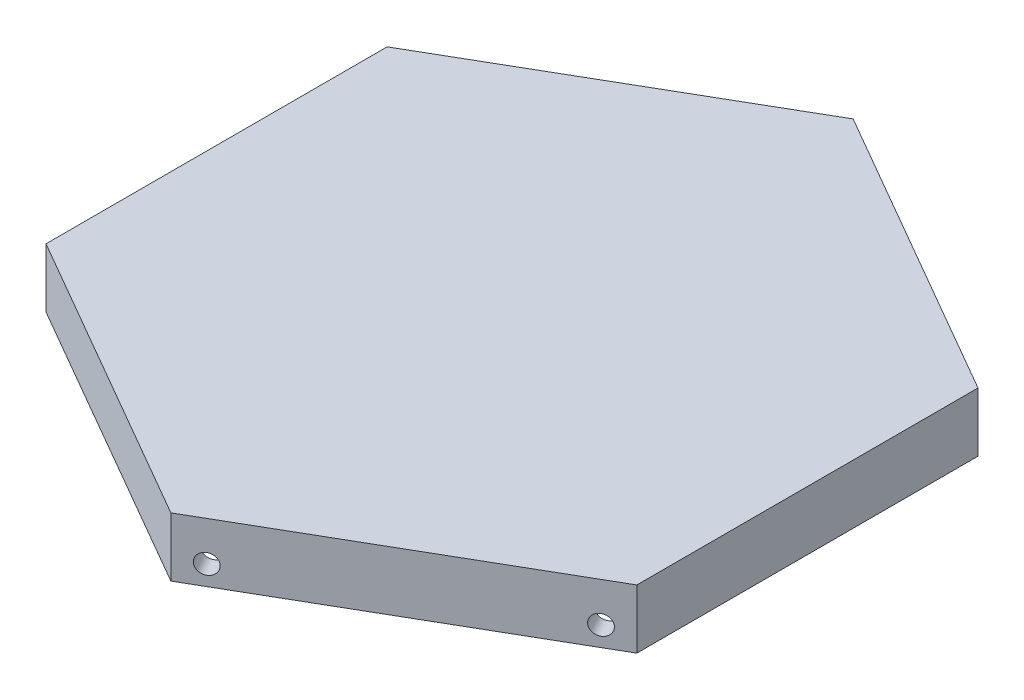
ISO-10303-21;
HEADER;
FILE_DESCRIPTION(('STEP AP214'),'2;1');
FILE_NAME('part.step','',(''),(''),'','','');
FILE_SCHEMA(('AUTOMOTIVE_DESIGN { 1 0 10303 214 1 1 1 1 }'));
ENDSEC;
DATA;
#1=APPLICATION_CONTEXT('core data for automotive mechanical design processes');
#2=APPLICATION_PROTOCOL_DEFINITION('international standard','automotive_design',2000,#1);
#3=PRODUCT_CONTEXT('',#1,'mechanical');
#4=PRODUCT('Part','Part','',(#3));
#5=PRODUCT_RELATED_PRODUCT_CATEGORY('part','',(#4));
#6=PRODUCT_DEFINITION_FORMATION('','',#4);
#7=PRODUCT_DEFINITION_CONTEXT('part definition',#1,'design');
#8=PRODUCT_DEFINITION('design','',#6,#7);
#9=PRODUCT_DEFINITION_SHAPE('','',#8);
#10=(LENGTH_UNIT() NAMED_UNIT(*) SI_UNIT(.MILLI.,.METRE.));
#11=(NAMED_UNIT(*) PLANE_ANGLE_UNIT() SI_UNIT($,.RADIAN.));
#12=(NAMED_UNIT(*) SI_UNIT($,.STERADIAN.) SOLID_ANGLE_UNIT());
#13=UNCERTAINTY_MEASURE_WITH_UNIT(LENGTH_MEASURE(1.E-05),#10,'distance_accuracy_value','');
#14=(GEOMETRIC_REPRESENTATION_CONTEXT(3) GLOBAL_UNCERTAINTY_ASSIGNED_CONTEXT((#13)) GLOBAL_UNIT_ASSIGNED_CONTEXT((#10,
#11,#12)) REPRESENTATION_CONTEXT('',''));
#15=CARTESIAN_POINT('',(0.,0.,0.));
#16=DIRECTION('',(0.,0.,1.));
#17=DIRECTION('',(1.,0.,0.));
#18=AXIS2_PLACEMENT_3D('',#15,#16,#17);
#19=CARTESIAN_POINT('',(44.9999999999996,9.,-25.9807621135336));
#20=DIRECTION('',(-0.499999999999995,0.,0.866025403784441));
#21=DIRECTION('',(0.866025403784441,0.,0.499999999999995));
#22=AXIS2_PLACEMENT_3D('',#19,#20,#21);
#23=PLANE('',#22);
#24=CARTESIAN_POINT('',(41.5358983848618,3.,-27.9807621135336));
#25=DIRECTION('',(0.499999999999995,0.,-0.866025403784441));
#26=DIRECTION('',(-0.866025403784441,0.,-0.499999999999995));
#27=AXIS2_PLACEMENT_3D('',#24,#25,#26);
#28=CIRCLE('',#27,1.5);
#29=CARTESIAN_POINT('',(40.2368602791852,3.,-28.7307621135336));
#30=VERTEX_POINT('',#29);
#31=EDGE_CURVE('E191',#30,#30,#28,.T.);
#32=ORIENTED_EDGE('',*,*,#31,.F.);
#33=EDGE_LOOP('',(#32));
#34=FACE_BOUND('',#33,.T.);
#35=CARTESIAN_POINT('',(3.46410161513776,3.,-49.9615242270662));
#36=DIRECTION('',(0.499999999999995,0.,-0.866025403784441));
#37=DIRECTION('',(0.866025403784441,0.,0.499999999999995));
#38=AXIS2_PLACEMENT_3D('',#35,#36,#37);
#39=CIRCLE('',#38,1.5);
#40=CARTESIAN_POINT('',(4.76313972081443,3.,-49.2115242270663));
#41=VERTEX_POINT('',#40);
#42=EDGE_CURVE('E199',#41,#41,#39,.T.);
#43=ORIENTED_EDGE('',*,*,#42,.F.);
#44=EDGE_LOOP('',(#43));
#45=FACE_BOUND('',#44,.T.);
#46=DIRECTION('',(-0.866025403784441,0.,-0.499999999999995));
#47=VECTOR('',#46,1.);
#48=CARTESIAN_POINT('',(44.9999999999996,0.,-25.9807621135336));
#49=LINE('',#48,#47);
#50=CARTESIAN_POINT('',(44.9999999999996,0.,-25.9807621135336));
#51=VERTEX_POINT('',#50);
#52=CARTESIAN_POINT('',(0.,0.,-51.9615242270662));
#53=VERTEX_POINT('',#52);
#54=EDGE_CURVE('E142',#51,#53,#49,.T.);
#55=ORIENTED_EDGE('',*,*,#54,.T.);
#56=DIRECTION('',(0.,-1.,0.));
#57=VECTOR('',#56,1.);
#58=CARTESIAN_POINT('',(0.,9.,-51.9615242270662));
#59=LINE('',#58,#57);
#60=CARTESIAN_POINT('',(0.,9.,-51.9615242270662));
#61=VERTEX_POINT('',#60);
#62=EDGE_CURVE('E11',#61,#53,#59,.T.);
#63=ORIENTED_EDGE('',*,*,#62,.F.);
#64=DIRECTION('',(-0.866025403784441,0.,-0.499999999999995));
#65=VECTOR('',#64,1.);
#66=CARTESIAN_POINT('',(44.9999999999996,9.,-25.9807621135336));
#67=LINE('',#66,#65);
#68=CARTESIAN_POINT('',(44.9999999999996,9.,-25.9807621135336));
#69=VERTEX_POINT('',#68);
#70=EDGE_CURVE('E160',#69,#61,#67,.T.);
#71=ORIENTED_EDGE('',*,*,#70,.F.);
#72=DIRECTION('',(0.,-1.,0.));
#73=VECTOR('',#72,1.);
#74=CARTESIAN_POINT('',(44.9999999999996,9.,-25.9807621135336));
#75=LINE('',#74,#73);
#76=EDGE_CURVE('E138',#69,#51,#75,.T.);
#77=ORIENTED_EDGE('',*,*,#76,.T.);
#78=EDGE_LOOP('',(#55,#63,#71,#77));
#79=FACE_BOUND('',#78,.T.);
#80=ADVANCED_FACE('F39',(#34,#45,#79),#23,.F.);
#81=CARTESIAN_POINT('',(0.,9.,-51.9615242270662));
#82=DIRECTION('',(0.500000000000001,0.,0.866025403784438));
#83=DIRECTION('',(0.866025403784438,0.,-0.500000000000001));
#84=AXIS2_PLACEMENT_3D('',#81,#82,#83);
#85=PLANE('',#84);
#86=DIRECTION('',(-0.866025403784438,0.,0.500000000000001));
#87=VECTOR('',#86,1.);
#88=CARTESIAN_POINT('',(0.,0.,-51.9615242270662));
#89=LINE('',#88,#87);
#90=CARTESIAN_POINT('',(-45.,0.,-25.980762113533));
#91=VERTEX_POINT('',#90);
#92=EDGE_CURVE('E146',#53,#91,#89,.T.);
#93=ORIENTED_EDGE('',*,*,#92,.T.);
#94=DIRECTION('',(0.,-1.,0.));
#95=VECTOR('',#94,1.);
#96=CARTESIAN_POINT('',(-45.,9.,-25.980762113533));
#97=LINE('',#96,#95);
#98=CARTESIAN_POINT('',(-45.,9.,-25.980762113533));
#99=VERTEX_POINT('',#98);
#100=EDGE_CURVE('E48',#99,#91,#97,.T.);
#101=ORIENTED_EDGE('',*,*,#100,.F.);
#102=DIRECTION('',(-0.866025403784438,0.,0.500000000000001));
#103=VECTOR('',#102,1.);
#104=CARTESIAN_POINT('',(0.,9.,-51.9615242270662));
#105=LINE('',#104,#103);
#106=EDGE_CURVE('E100',#61,#99,#105,.T.);
#107=ORIENTED_EDGE('',*,*,#106,.F.);
#108=ORIENTED_EDGE('',*,*,#62,.T.);
#109=EDGE_LOOP('',(#93,#101,#107,#108));
#110=FACE_BOUND('',#109,.T.);
#111=ADVANCED_FACE('F292',(#110),#85,.F.);
#112=CARTESIAN_POINT('',(-45.,9.,-25.980762113533));
#113=DIRECTION('',(1.,0.,0.));
#114=DIRECTION('',(0.,0.,-1.));
#115=AXIS2_PLACEMENT_3D('',#112,#113,#114);
#116=PLANE('',#115);
#117=CARTESIAN_POINT('',(-45.,3.,-21.980762113533));
#118=DIRECTION('',(-1.,0.,0.));
#119=DIRECTION('',(0.,0.,1.));
#120=AXIS2_PLACEMENT_3D('',#117,#118,#119);
#121=CIRCLE('',#120,1.5);
#122=CARTESIAN_POINT('',(-45.,3.,-20.480762113533));
#123=VERTEX_POINT('',#122);
#124=EDGE_CURVE('E175',#123,#123,#121,.T.);
#125=ORIENTED_EDGE('',*,*,#124,.F.);
#126=EDGE_LOOP('',(#125));
#127=FACE_BOUND('',#126,.T.);
#128=CARTESIAN_POINT('',(-44.9999999999998,3.,21.9807621135333));
#129=DIRECTION('',(-1.,0.,0.));
#130=DIRECTION('',(0.,0.,-1.));
#131=AXIS2_PLACEMENT_3D('',#128,#129,#130);
#132=CIRCLE('',#131,1.5);
#133=CARTESIAN_POINT('',(-44.9999999999998,3.,20.4807621135333));
#134=VERTEX_POINT('',#133);
#135=EDGE_CURVE('E187',#134,#134,#132,.T.);
#136=ORIENTED_EDGE('',*,*,#135,.F.);
#137=EDGE_LOOP('',(#136));
#138=FACE_BOUND('',#137,.T.);
#139=DIRECTION('',(0.,0.,1.));
#140=VECTOR('',#139,1.);
#141=CARTESIAN_POINT('',(-45.,0.,-25.980762113533));
#142=LINE('',#141,#140);
#143=CARTESIAN_POINT('',(-44.9999999999998,0.,25.9807621135333));
#144=VERTEX_POINT('',#143);
#145=EDGE_CURVE('E150',#91,#144,#142,.T.);
#146=ORIENTED_EDGE('',*,*,#145,.T.);
#147=DIRECTION('',(0.,-1.,0.));
#148=VECTOR('',#147,1.);
#149=CARTESIAN_POINT('',(-44.9999999999998,9.,25.9807621135333));
#150=LINE('',#149,#148);
#151=CARTESIAN_POINT('',(-44.9999999999998,9.,25.9807621135333));
#152=VERTEX_POINT('',#151);
#153=EDGE_CURVE('E131',#152,#144,#150,.T.);
#154=ORIENTED_EDGE('',*,*,#153,.F.);
#155=DIRECTION('',(0.,0.,1.));
#156=VECTOR('',#155,1.);
#157=CARTESIAN_POINT('',(-45.,9.,-25.980762113533));
#158=LINE('',#157,#156);
#159=EDGE_CURVE('E117',#99,#152,#158,.T.);
#160=ORIENTED_EDGE('',*,*,#159,.F.);
#161=ORIENTED_EDGE('',*,*,#100,.T.);
#162=EDGE_LOOP('',(#146,#154,#160,#161));
#163=FACE_BOUND('',#162,.T.);
#164=ADVANCED_FACE('F295',(#127,#138,#163),#116,.F.);
#165=CARTESIAN_POINT('',(-44.9999999999998,9.,25.9807621135333));
#166=DIRECTION('',(0.499999999999995,0.,-0.866025403784442));
#167=DIRECTION('',(-0.866025403784442,0.,-0.499999999999995));
#168=AXIS2_PLACEMENT_3D('',#165,#166,#167);
#169=PLANE('',#168);
#170=DIRECTION('',(0.866025403784442,0.,0.499999999999995));
#171=VECTOR('',#170,1.);
#172=CARTESIAN_POINT('',(-44.9999999999998,0.,25.9807621135333));
#173=LINE('',#172,#171);
#174=CARTESIAN_POINT('',(3.62845384353294E-13,0.,51.9615242270662));
#175=VERTEX_POINT('',#174);
#176=EDGE_CURVE('E127',#144,#175,#173,.T.);
#177=ORIENTED_EDGE('',*,*,#176,.T.);
#178=DIRECTION('',(0.,-1.,0.));
#179=VECTOR('',#178,1.);
#180=CARTESIAN_POINT('',(3.62845384353294E-13,9.,51.9615242270662));
#181=LINE('',#180,#179);
#182=CARTESIAN_POINT('',(3.62845384353294E-13,9.,51.9615242270662));
#183=VERTEX_POINT('',#182);
#184=EDGE_CURVE('E124',#183,#175,#181,.T.);
#185=ORIENTED_EDGE('',*,*,#184,.F.);
#186=DIRECTION('',(0.866025403784442,0.,0.499999999999995));
#187=VECTOR('',#186,1.);
#188=CARTESIAN_POINT('',(-44.9999999999998,9.,25.9807621135333));
#189=LINE('',#188,#187);
#190=EDGE_CURVE('E110',#152,#183,#189,.T.);
#191=ORIENTED_EDGE('',*,*,#190,.F.);
#192=ORIENTED_EDGE('',*,*,#153,.T.);
#193=EDGE_LOOP('',(#177,#185,#191,#192));
#194=FACE_BOUND('',#193,.T.);
#195=ADVANCED_FACE('F125',(#194),#169,.F.);
#196=CARTESIAN_POINT('',(3.62845384353294E-13,9.,51.9615242270662));
#197=DIRECTION('',(-0.500000000000007,0.,-0.866025403784434));
#198=DIRECTION('',(-0.866025403784435,0.,0.500000000000007));
#199=AXIS2_PLACEMENT_3D('',#196,#197,#198);
#200=PLANE('',#199);
#201=CARTESIAN_POINT('',(3.46410161513811,3.,49.9615242270662));
#202=DIRECTION('',(0.500000000000007,0.,0.866025403784435));
#203=DIRECTION('',(0.866025403784435,0.,-0.500000000000007));
#204=AXIS2_PLACEMENT_3D('',#201,#202,#203);
#205=CIRCLE('',#204,1.5);
#206=CARTESIAN_POINT('',(4.76313972081476,3.,49.2115242270662));
#207=VERTEX_POINT('',#206);
#208=EDGE_CURVE('E184',#207,#207,#205,.T.);
#209=ORIENTED_EDGE('',*,*,#208,.F.);
#210=EDGE_LOOP('',(#209));
#211=FACE_BOUND('',#210,.T.);
#212=CARTESIAN_POINT('',(41.5358983848624,3.,27.9807621135327));
#213=DIRECTION('',(0.500000000000007,0.,0.866025403784435));
#214=DIRECTION('',(-0.866025403784435,0.,0.500000000000007));
#215=AXIS2_PLACEMENT_3D('',#212,#213,#214);
#216=CIRCLE('',#215,1.5);
#217=CARTESIAN_POINT('',(40.2368602791858,3.,28.7307621135327));
#218=VERTEX_POINT('',#217);
#219=EDGE_CURVE('E197',#218,#218,#216,.T.);
#220=ORIENTED_EDGE('',*,*,#219,.F.);
#221=EDGE_LOOP('',(#220));
#222=FACE_BOUND('',#221,.T.);
#223=DIRECTION('',(0.866025403784435,0.,-0.500000000000007));
#224=VECTOR('',#223,1.);
#225=CARTESIAN_POINT('',(3.62845384353294E-13,0.,51.9615242270662));
#226=LINE('',#225,#224);
#227=CARTESIAN_POINT('',(45.0000000000002,0.,25.9807621135327));
#228=VERTEX_POINT('',#227);
#229=EDGE_CURVE('E155',#175,#228,#226,.T.);
#230=ORIENTED_EDGE('',*,*,#229,.T.);
#231=DIRECTION('',(0.,-1.,0.));
#232=VECTOR('',#231,1.);
#233=CARTESIAN_POINT('',(45.0000000000002,9.,25.9807621135327));
#234=LINE('',#233,#232);
#235=CARTESIAN_POINT('',(45.0000000000002,9.,25.9807621135327));
#236=VERTEX_POINT('',#235);
#237=EDGE_CURVE('E132',#236,#228,#234,.T.);
#238=ORIENTED_EDGE('',*,*,#237,.F.);
#239=DIRECTION('',(0.866025403784435,0.,-0.500000000000007));
#240=VECTOR('',#239,1.);
#241=CARTESIAN_POINT('',(3.62845384353294E-13,9.,51.9615242270662));
#242=LINE('',#241,#240);
#243=EDGE_CURVE('E114',#183,#236,#242,.T.);
#244=ORIENTED_EDGE('',*,*,#243,.F.);
#245=ORIENTED_EDGE('',*,*,#184,.T.);
#246=EDGE_LOOP('',(#230,#238,#244,#245));
#247=FACE_BOUND('',#246,.T.);
#248=ADVANCED_FACE('F134',(#211,#222,#247),#200,.F.);
#249=CARTESIAN_POINT('',(45.0000000000002,9.,25.9807621135327));
#250=DIRECTION('',(-1.,0.,0.));
#251=DIRECTION('',(0.,0.,1.));
#252=AXIS2_PLACEMENT_3D('',#249,#250,#251);
#253=PLANE('',#252);
#254=DIRECTION('',(0.,0.,-1.));
#255=VECTOR('',#254,1.);
#256=CARTESIAN_POINT('',(45.0000000000002,0.,25.9807621135327));
#257=LINE('',#256,#255);
#258=EDGE_CURVE('E92',#228,#51,#257,.T.);
#259=ORIENTED_EDGE('',*,*,#258,.T.);
#260=ORIENTED_EDGE('',*,*,#76,.F.);
#261=DIRECTION('',(0.,0.,-1.));
#262=VECTOR('',#261,1.);
#263=CARTESIAN_POINT('',(45.0000000000002,9.,25.9807621135327));
#264=LINE('',#263,#262);
#265=EDGE_CURVE('E65',#236,#69,#264,.T.);
#266=ORIENTED_EDGE('',*,*,#265,.F.);
#267=ORIENTED_EDGE('',*,*,#237,.T.);
#268=EDGE_LOOP('',(#259,#260,#266,#267));
#269=FACE_BOUND('',#268,.T.);
#270=ADVANCED_FACE('F299',(#269),#253,.F.);
#271=CARTESIAN_POINT('',(0.,9.,0.));
#272=DIRECTION('',(0.,1.,0.));
#273=DIRECTION('',(0.,0.,1.));
#274=AXIS2_PLACEMENT_3D('',#271,#272,#273);
#275=PLANE('',#274);
#276=ORIENTED_EDGE('',*,*,#70,.T.);
#277=ORIENTED_EDGE('',*,*,#106,.T.);
#278=ORIENTED_EDGE('',*,*,#159,.T.);
#279=ORIENTED_EDGE('',*,*,#190,.T.);
#280=ORIENTED_EDGE('',*,*,#243,.T.);
#281=ORIENTED_EDGE('',*,*,#265,.T.);
#282=EDGE_LOOP('',(#276,#277,#278,#279,#280,#281));
#283=FACE_BOUND('',#282,.T.);
#284=ADVANCED_FACE('F112',(#283),#275,.T.);
#285=CARTESIAN_POINT('',(0.,0.,0.));
#286=DIRECTION('',(0.,1.,0.));
#287=DIRECTION('',(0.,0.,1.));
#288=AXIS2_PLACEMENT_3D('',#285,#286,#287);
#289=PLANE('',#288);
#290=DIRECTION('',(-0.866025403784439,0.,-0.5));
#291=VECTOR('',#290,1.);
#292=CARTESIAN_POINT('',(0.,0.,48.4974226119285));
#293=LINE('',#292,#291);
#294=CARTESIAN_POINT('',(0.,0.,48.4974226119285));
#295=VERTEX_POINT('',#294);
#296=CARTESIAN_POINT('',(-42.,0.,24.2487113059643));
#297=VERTEX_POINT('',#296);
#298=EDGE_CURVE('E247',#295,#297,#293,.T.);
#299=ORIENTED_EDGE('',*,*,#298,.F.);
#300=DIRECTION('',(-0.866025403784439,0.,0.5));
#301=VECTOR('',#300,1.);
#302=CARTESIAN_POINT('',(42.,0.,24.2487113059643));
#303=LINE('',#302,#301);
#304=CARTESIAN_POINT('',(42.,0.,24.2487113059643));
#305=VERTEX_POINT('',#304);
#306=EDGE_CURVE('E56',#305,#295,#303,.T.);
#307=ORIENTED_EDGE('',*,*,#306,.F.);
#308=DIRECTION('',(0.,0.,1.));
#309=VECTOR('',#308,1.);
#310=CARTESIAN_POINT('',(42.,0.,-24.2487113059643));
#311=LINE('',#310,#309);
#312=CARTESIAN_POINT('',(42.,0.,-24.2487113059643));
#313=VERTEX_POINT('',#312);
#314=EDGE_CURVE('E224',#313,#305,#311,.T.);
#315=ORIENTED_EDGE('',*,*,#314,.F.);
#316=DIRECTION('',(0.866025403784439,0.,0.5));
#317=VECTOR('',#316,1.);
#318=CARTESIAN_POINT('',(0.,0.,-48.4974226119285));
#319=LINE('',#318,#317);
#320=CARTESIAN_POINT('',(0.,0.,-48.4974226119285));
#321=VERTEX_POINT('',#320);
#322=EDGE_CURVE('E259',#321,#313,#319,.T.);
#323=ORIENTED_EDGE('',*,*,#322,.F.);
#324=DIRECTION('',(0.866025403784439,0.,-0.5));
#325=VECTOR('',#324,1.);
#326=CARTESIAN_POINT('',(-42.,0.,-24.2487113059643));
#327=LINE('',#326,#325);
#328=CARTESIAN_POINT('',(-42.,0.,-24.2487113059643));
#329=VERTEX_POINT('',#328);
#330=EDGE_CURVE('E255',#329,#321,#327,.T.);
#331=ORIENTED_EDGE('',*,*,#330,.F.);
#332=DIRECTION('',(0.,0.,-1.));
#333=VECTOR('',#332,1.);
#334=CARTESIAN_POINT('',(-42.,0.,24.2487113059643));
#335=LINE('',#334,#333);
#336=EDGE_CURVE('E251',#297,#329,#335,.T.);
#337=ORIENTED_EDGE('',*,*,#336,.F.);
#338=EDGE_LOOP('',(#299,#307,#315,#323,#331,#337));
#339=FACE_BOUND('',#338,.T.);
#340=ORIENTED_EDGE('',*,*,#54,.F.);
#341=ORIENTED_EDGE('',*,*,#258,.F.);
#342=ORIENTED_EDGE('',*,*,#229,.F.);
#343=ORIENTED_EDGE('',*,*,#176,.F.);
#344=ORIENTED_EDGE('',*,*,#145,.F.);
#345=ORIENTED_EDGE('',*,*,#92,.F.);
#346=EDGE_LOOP('',(#340,#341,#342,#343,#344,#345));
#347=FACE_BOUND('',#346,.T.);
#348=ADVANCED_FACE('F298',(#339,#347),#289,.F.);
#349=CARTESIAN_POINT('',(42.,6.,24.2487113059643));
#350=DIRECTION('',(0.5,0.,0.866025403784439));
#351=DIRECTION('',(0.866025403784439,0.,-0.5));
#352=AXIS2_PLACEMENT_3D('',#349,#350,#351);
#353=PLANE('',#352);
#354=CARTESIAN_POINT('',(1.96410161513804,3.,47.3634480157128));
#355=DIRECTION('',(0.5,0.,0.866025403784439));
#356=DIRECTION('',(0.866025403784439,0.,-0.5));
#357=AXIS2_PLACEMENT_3D('',#354,#355,#356);
#358=CIRCLE('',#357,1.5);
#359=CARTESIAN_POINT('',(3.2631397208147,3.,46.6134480157128));
#360=VERTEX_POINT('',#359);
#361=EDGE_CURVE('E183',#360,#360,#358,.T.);
#362=ORIENTED_EDGE('',*,*,#361,.T.);
#363=EDGE_LOOP('',(#362));
#364=FACE_BOUND('',#363,.T.);
#365=CARTESIAN_POINT('',(40.0358983848625,3.,25.3826859021797));
#366=DIRECTION('',(0.5,0.,0.866025403784439));
#367=DIRECTION('',(0.866025403784439,0.,-0.5));
#368=AXIS2_PLACEMENT_3D('',#365,#366,#367);
#369=CIRCLE('',#368,1.5);
#370=CARTESIAN_POINT('',(41.3349364905392,3.,24.6326859021797));
#371=VERTEX_POINT('',#370);
#372=EDGE_CURVE('E179',#371,#371,#369,.T.);
#373=ORIENTED_EDGE('',*,*,#372,.T.);
#374=EDGE_LOOP('',(#373));
#375=FACE_BOUND('',#374,.T.);
#376=ORIENTED_EDGE('',*,*,#306,.T.);
#377=DIRECTION('',(0.,-1.,0.));
#378=VECTOR('',#377,1.);
#379=CARTESIAN_POINT('',(0.,6.,48.4974226119285));
#380=LINE('',#379,#378);
#381=CARTESIAN_POINT('',(0.,6.,48.4974226119285));
#382=VERTEX_POINT('',#381);
#383=EDGE_CURVE('E244',#382,#295,#380,.T.);
#384=ORIENTED_EDGE('',*,*,#383,.F.);
#385=DIRECTION('',(-0.866025403784439,0.,0.5));
#386=VECTOR('',#385,1.);
#387=CARTESIAN_POINT('',(42.,6.,24.2487113059643));
#388=LINE('',#387,#386);
#389=CARTESIAN_POINT('',(42.,6.,24.2487113059643));
#390=VERTEX_POINT('',#389);
#391=EDGE_CURVE('E219',#390,#382,#388,.T.);
#392=ORIENTED_EDGE('',*,*,#391,.F.);
#393=DIRECTION('',(0.,-1.,0.));
#394=VECTOR('',#393,1.);
#395=CARTESIAN_POINT('',(42.,6.,24.2487113059643));
#396=LINE('',#395,#394);
#397=EDGE_CURVE('E147',#390,#305,#396,.T.);
#398=ORIENTED_EDGE('',*,*,#397,.T.);
#399=EDGE_LOOP('',(#376,#384,#392,#398));
#400=FACE_BOUND('',#399,.T.);
#401=ADVANCED_FACE('F344',(#364,#375,#400),#353,.F.);
#402=CARTESIAN_POINT('',(42.,6.,-24.2487113059643));
#403=DIRECTION('',(1.,0.,0.));
#404=DIRECTION('',(0.,0.,-1.));
#405=AXIS2_PLACEMENT_3D('',#402,#403,#404);
#406=PLANE('',#405);
#407=ORIENTED_EDGE('',*,*,#314,.T.);
#408=ORIENTED_EDGE('',*,*,#397,.F.);
#409=DIRECTION('',(0.,0.,1.));
#410=VECTOR('',#409,1.);
#411=CARTESIAN_POINT('',(42.,6.,-24.2487113059643));
#412=LINE('',#411,#410);
#413=CARTESIAN_POINT('',(42.,6.,-24.2487113059643));
#414=VERTEX_POINT('',#413);
#415=EDGE_CURVE('E240',#414,#390,#412,.T.);
#416=ORIENTED_EDGE('',*,*,#415,.F.);
#417=DIRECTION('',(0.,-1.,0.));
#418=VECTOR('',#417,1.);
#419=CARTESIAN_POINT('',(42.,6.,-24.2487113059643));
#420=LINE('',#419,#418);
#421=EDGE_CURVE('E268',#414,#313,#420,.T.);
#422=ORIENTED_EDGE('',*,*,#421,.T.);
#423=EDGE_LOOP('',(#407,#408,#416,#422));
#424=FACE_BOUND('',#423,.T.);
#425=ADVANCED_FACE('F340',(#424),#406,.F.);
#426=CARTESIAN_POINT('',(0.,6.,-48.4974226119285));
#427=DIRECTION('',(0.5,0.,-0.866025403784439));
#428=DIRECTION('',(-0.866025403784439,0.,-0.5));
#429=AXIS2_PLACEMENT_3D('',#426,#427,#428);
#430=PLANE('',#429);
#431=CARTESIAN_POINT('',(40.0358983848618,3.,-25.3826859021801));
#432=DIRECTION('',(0.5,0.,-0.866025403784439));
#433=DIRECTION('',(-0.866025403784439,0.,-0.5));
#434=AXIS2_PLACEMENT_3D('',#431,#432,#433);
#435=CIRCLE('',#434,1.5);
#436=CARTESIAN_POINT('',(38.7368602791851,3.,-26.1326859021801));
#437=VERTEX_POINT('',#436);
#438=EDGE_CURVE('E42',#437,#437,#435,.T.);
#439=ORIENTED_EDGE('',*,*,#438,.T.);
#440=EDGE_LOOP('',(#439));
#441=FACE_BOUND('',#440,.T.);
#442=CARTESIAN_POINT('',(1.9641016151378,3.,-47.363448015713));
#443=DIRECTION('',(0.5,0.,-0.866025403784439));
#444=DIRECTION('',(-0.866025403784439,0.,-0.5));
#445=AXIS2_PLACEMENT_3D('',#442,#443,#444);
#446=CIRCLE('',#445,1.5);
#447=CARTESIAN_POINT('',(0.665063509461138,3.,-48.113448015713));
#448=VERTEX_POINT('',#447);
#449=EDGE_CURVE('E188',#448,#448,#446,.T.);
#450=ORIENTED_EDGE('',*,*,#449,.T.);
#451=EDGE_LOOP('',(#450));
#452=FACE_BOUND('',#451,.T.);
#453=ORIENTED_EDGE('',*,*,#322,.T.);
#454=ORIENTED_EDGE('',*,*,#421,.F.);
#455=DIRECTION('',(0.866025403784439,0.,0.5));
#456=VECTOR('',#455,1.);
#457=CARTESIAN_POINT('',(0.,6.,-48.4974226119285));
#458=LINE('',#457,#456);
#459=CARTESIAN_POINT('',(0.,6.,-48.4974226119285));
#460=VERTEX_POINT('',#459);
#461=EDGE_CURVE('E236',#460,#414,#458,.T.);
#462=ORIENTED_EDGE('',*,*,#461,.F.);
#463=DIRECTION('',(0.,-1.,0.));
#464=VECTOR('',#463,1.);
#465=CARTESIAN_POINT('',(0.,6.,-48.4974226119285));
#466=LINE('',#465,#464);
#467=EDGE_CURVE('E272',#460,#321,#466,.T.);
#468=ORIENTED_EDGE('',*,*,#467,.T.);
#469=EDGE_LOOP('',(#453,#454,#462,#468));
#470=FACE_BOUND('',#469,.T.);
#471=ADVANCED_FACE('F343',(#441,#452,#470),#430,.F.);
#472=CARTESIAN_POINT('',(-42.,6.,-24.2487113059643));
#473=DIRECTION('',(-0.5,0.,-0.866025403784439));
#474=DIRECTION('',(-0.866025403784439,0.,0.5));
#475=AXIS2_PLACEMENT_3D('',#472,#473,#474);
#476=PLANE('',#475);
#477=ORIENTED_EDGE('',*,*,#330,.T.);
#478=ORIENTED_EDGE('',*,*,#467,.F.);
#479=DIRECTION('',(0.866025403784439,0.,-0.5));
#480=VECTOR('',#479,1.);
#481=CARTESIAN_POINT('',(-42.,6.,-24.2487113059643));
#482=LINE('',#481,#480);
#483=CARTESIAN_POINT('',(-42.,6.,-24.2487113059643));
#484=VERTEX_POINT('',#483);
#485=EDGE_CURVE('E232',#484,#460,#482,.T.);
#486=ORIENTED_EDGE('',*,*,#485,.F.);
#487=DIRECTION('',(0.,-1.,0.));
#488=VECTOR('',#487,1.);
#489=CARTESIAN_POINT('',(-42.,6.,-24.2487113059643));
#490=LINE('',#489,#488);
#491=EDGE_CURVE('E276',#484,#329,#490,.T.);
#492=ORIENTED_EDGE('',*,*,#491,.T.);
#493=EDGE_LOOP('',(#477,#478,#486,#492));
#494=FACE_BOUND('',#493,.T.);
#495=ADVANCED_FACE('F348',(#494),#476,.F.);
#496=CARTESIAN_POINT('',(-42.,6.,24.2487113059643));
#497=DIRECTION('',(-1.,0.,0.));
#498=DIRECTION('',(0.,0.,1.));
#499=AXIS2_PLACEMENT_3D('',#496,#497,#498);
#500=PLANE('',#499);
#501=CARTESIAN_POINT('',(-42.,3.,-21.980762113533));
#502=DIRECTION('',(-1.,0.,0.));
#503=DIRECTION('',(0.,0.,1.));
#504=AXIS2_PLACEMENT_3D('',#501,#502,#503);
#505=CIRCLE('',#504,1.5);
#506=CARTESIAN_POINT('',(-42.,3.,-20.480762113533));
#507=VERTEX_POINT('',#506);
#508=EDGE_CURVE('E174',#507,#507,#505,.T.);
#509=ORIENTED_EDGE('',*,*,#508,.T.);
#510=EDGE_LOOP('',(#509));
#511=FACE_BOUND('',#510,.T.);
#512=CARTESIAN_POINT('',(-42.,3.,21.9807621135333));
#513=DIRECTION('',(-1.,0.,0.));
#514=DIRECTION('',(0.,0.,1.));
#515=AXIS2_PLACEMENT_3D('',#512,#513,#514);
#516=CIRCLE('',#515,1.5);
#517=CARTESIAN_POINT('',(-42.,3.,23.4807621135333));
#518=VERTEX_POINT('',#517);
#519=EDGE_CURVE('E170',#518,#518,#516,.T.);
#520=ORIENTED_EDGE('',*,*,#519,.T.);
#521=EDGE_LOOP('',(#520));
#522=FACE_BOUND('',#521,.T.);
#523=ORIENTED_EDGE('',*,*,#336,.T.);
#524=ORIENTED_EDGE('',*,*,#491,.F.);
#525=DIRECTION('',(0.,0.,-1.));
#526=VECTOR('',#525,1.);
#527=CARTESIAN_POINT('',(-42.,6.,24.2487113059643));
#528=LINE('',#527,#526);
#529=CARTESIAN_POINT('',(-42.,6.,24.2487113059643));
#530=VERTEX_POINT('',#529);
#531=EDGE_CURVE('E228',#530,#484,#528,.T.);
#532=ORIENTED_EDGE('',*,*,#531,.F.);
#533=DIRECTION('',(0.,-1.,0.));
#534=VECTOR('',#533,1.);
#535=CARTESIAN_POINT('',(-42.,6.,24.2487113059643));
#536=LINE('',#535,#534);
#537=EDGE_CURVE('E280',#530,#297,#536,.T.);
#538=ORIENTED_EDGE('',*,*,#537,.T.);
#539=EDGE_LOOP('',(#523,#524,#532,#538));
#540=FACE_BOUND('',#539,.T.);
#541=ADVANCED_FACE('F352',(#511,#522,#540),#500,.F.);
#542=CARTESIAN_POINT('',(0.,6.,48.4974226119285));
#543=DIRECTION('',(-0.5,0.,0.866025403784439));
#544=DIRECTION('',(0.866025403784439,0.,0.5));
#545=AXIS2_PLACEMENT_3D('',#542,#543,#544);
#546=PLANE('',#545);
#547=ORIENTED_EDGE('',*,*,#298,.T.);
#548=ORIENTED_EDGE('',*,*,#537,.F.);
#549=DIRECTION('',(-0.866025403784439,0.,-0.5));
#550=VECTOR('',#549,1.);
#551=CARTESIAN_POINT('',(0.,6.,48.4974226119285));
#552=LINE('',#551,#550);
#553=EDGE_CURVE('E223',#382,#530,#552,.T.);
#554=ORIENTED_EDGE('',*,*,#553,.F.);
#555=ORIENTED_EDGE('',*,*,#383,.T.);
#556=EDGE_LOOP('',(#547,#548,#554,#555));
#557=FACE_BOUND('',#556,.T.);
#558=ADVANCED_FACE('F338',(#557),#546,.F.);
#559=CARTESIAN_POINT('',(0.,6.,0.));
#560=DIRECTION('',(0.,-1.,0.));
#561=DIRECTION('',(0.,0.,-1.));
#562=AXIS2_PLACEMENT_3D('',#559,#560,#561);
#563=PLANE('',#562);
#564=ORIENTED_EDGE('',*,*,#391,.T.);
#565=ORIENTED_EDGE('',*,*,#553,.T.);
#566=ORIENTED_EDGE('',*,*,#531,.T.);
#567=ORIENTED_EDGE('',*,*,#485,.T.);
#568=ORIENTED_EDGE('',*,*,#461,.T.);
#569=ORIENTED_EDGE('',*,*,#415,.T.);
#570=EDGE_LOOP('',(#564,#565,#566,#567,#568,#569));
#571=FACE_BOUND('',#570,.T.);
#572=ADVANCED_FACE('F334',(#571),#563,.T.);
#573=CARTESIAN_POINT('',(-39.9999999999998,3.,21.9807621135333));
#574=DIRECTION('',(-1.,0.,0.));
#575=DIRECTION('',(0.,0.,1.));
#576=AXIS2_PLACEMENT_3D('',#573,#574,#575);
#577=CYLINDRICAL_SURFACE('',#576,1.5);
#578=ORIENTED_EDGE('',*,*,#135,.T.);
#579=EDGE_LOOP('',(#578));
#580=FACE_BOUND('',#579,.T.);
#581=ORIENTED_EDGE('',*,*,#519,.F.);
#582=EDGE_LOOP('',(#581));
#583=FACE_BOUND('',#582,.T.);
#584=ADVANCED_FACE('F330',(#580,#583),#577,.F.);
#585=CARTESIAN_POINT('',(-40.,3.,-21.980762113533));
#586=DIRECTION('',(-1.,0.,0.));
#587=DIRECTION('',(0.,0.,1.));
#588=AXIS2_PLACEMENT_3D('',#585,#586,#587);
#589=CYLINDRICAL_SURFACE('',#588,1.5);
#590=ORIENTED_EDGE('',*,*,#124,.T.);
#591=EDGE_LOOP('',(#590));
#592=FACE_BOUND('',#591,.T.);
#593=ORIENTED_EDGE('',*,*,#508,.F.);
#594=EDGE_LOOP('',(#593));
#595=FACE_BOUND('',#594,.T.);
#596=ADVANCED_FACE('F326',(#592,#595),#589,.F.);
#597=CARTESIAN_POINT('',(39.0358983848624,3.,23.6506350946106));
#598=DIRECTION('',(0.500000000000007,0.,0.866025403784434));
#599=DIRECTION('',(0.866025403784435,0.,-0.500000000000007));
#600=AXIS2_PLACEMENT_3D('',#597,#598,#599);
#601=CYLINDRICAL_SURFACE('',#600,1.5);
#602=ORIENTED_EDGE('',*,*,#219,.T.);
#603=EDGE_LOOP('',(#602));
#604=FACE_BOUND('',#603,.T.);
#605=ORIENTED_EDGE('',*,*,#372,.F.);
#606=EDGE_LOOP('',(#605));
#607=FACE_BOUND('',#606,.T.);
#608=ADVANCED_FACE('F320',(#604,#607),#601,.F.);
#609=CARTESIAN_POINT('',(0.964101615138076,3.,45.631397208144));
#610=DIRECTION('',(0.500000000000007,0.,0.866025403784434));
#611=DIRECTION('',(0.866025403784435,0.,-0.500000000000007));
#612=AXIS2_PLACEMENT_3D('',#609,#610,#611);
#613=CYLINDRICAL_SURFACE('',#612,1.5);
#614=ORIENTED_EDGE('',*,*,#208,.T.);
#615=EDGE_LOOP('',(#614));
#616=FACE_BOUND('',#615,.T.);
#617=ORIENTED_EDGE('',*,*,#361,.F.);
#618=EDGE_LOOP('',(#617));
#619=FACE_BOUND('',#618,.T.);
#620=ADVANCED_FACE('F313',(#616,#619),#613,.F.);
#621=CARTESIAN_POINT('',(0.964101615137789,3.,-45.631397208144));
#622=DIRECTION('',(0.499999999999995,0.,-0.866025403784441));
#623=DIRECTION('',(-0.866025403784441,0.,-0.499999999999995));
#624=AXIS2_PLACEMENT_3D('',#621,#622,#623);
#625=CYLINDRICAL_SURFACE('',#624,1.5);
#626=ORIENTED_EDGE('',*,*,#42,.T.);
#627=EDGE_LOOP('',(#626));
#628=FACE_BOUND('',#627,.T.);
#629=ORIENTED_EDGE('',*,*,#449,.F.);
#630=EDGE_LOOP('',(#629));
#631=FACE_BOUND('',#630,.T.);
#632=ADVANCED_FACE('F309',(#628,#631),#625,.F.);
#633=CARTESIAN_POINT('',(39.0358983848619,3.,-23.6506350946114));
#634=DIRECTION('',(0.499999999999995,0.,-0.866025403784441));
#635=DIRECTION('',(-0.866025403784441,0.,-0.499999999999995));
#636=AXIS2_PLACEMENT_3D('',#633,#634,#635);
#637=CYLINDRICAL_SURFACE('',#636,1.5);
#638=ORIENTED_EDGE('',*,*,#31,.T.);
#639=EDGE_LOOP('',(#638));
#640=FACE_BOUND('',#639,.T.);
#641=ORIENTED_EDGE('',*,*,#438,.F.);
#642=EDGE_LOOP('',(#641));
#643=FACE_BOUND('',#642,.T.);
#644=ADVANCED_FACE('F312',(#640,#643),#637,.F.);
#645=CLOSED_SHELL('',(#80,#111,#164,#195,#248,#270,#284,#348,#401,#425,#471,#495,#541,#558,#572,
#584,#596,#608,#620,#632,#644));
#646=MANIFOLD_SOLID_BREP('B2',#645);
#647=ADVANCED_BREP_SHAPE_REPRESENTATION('',(#18,#646),#14);
#648=SHAPE_DEFINITION_REPRESENTATION(#9,#647);
ENDSEC;
END-ISO-10303-21;
